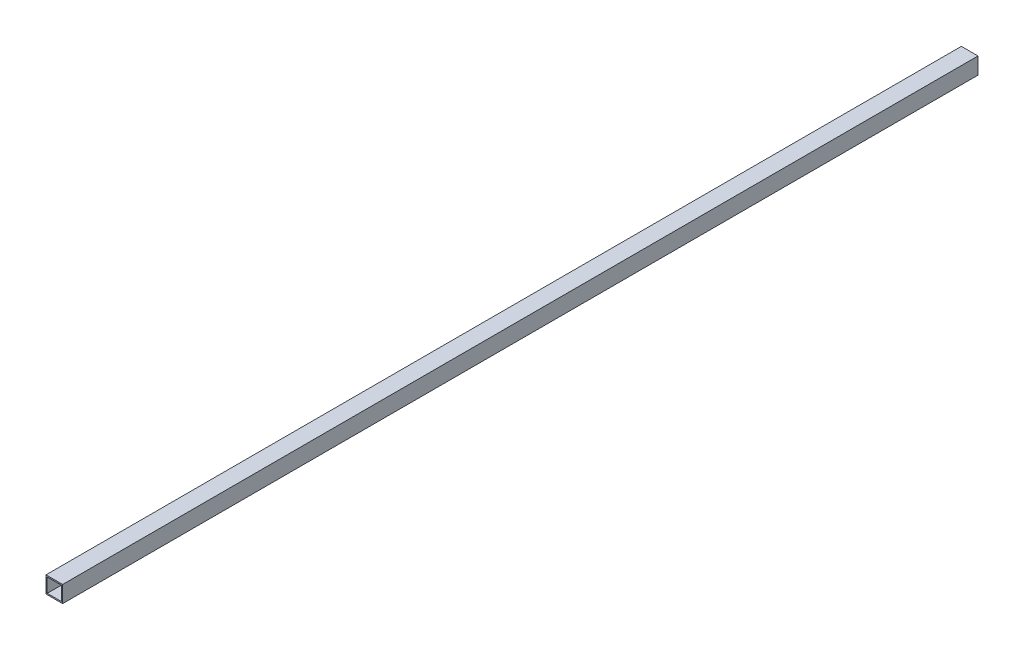
ISO-10303-21;
HEADER;
FILE_DESCRIPTION(('STEP AP214'),'2;1');
FILE_NAME('part.step','',(''),(''),'','','');
FILE_SCHEMA(('AUTOMOTIVE_DESIGN { 1 0 10303 214 1 1 1 1 }'));
ENDSEC;
DATA;
#1=APPLICATION_CONTEXT('core data for automotive mechanical design processes');
#2=APPLICATION_PROTOCOL_DEFINITION('international standard','automotive_design',2000,#1);
#3=PRODUCT_CONTEXT('',#1,'mechanical');
#4=PRODUCT('Part','Part','',(#3));
#5=PRODUCT_RELATED_PRODUCT_CATEGORY('part','',(#4));
#6=PRODUCT_DEFINITION_FORMATION('','',#4);
#7=PRODUCT_DEFINITION_CONTEXT('part definition',#1,'design');
#8=PRODUCT_DEFINITION('design','',#6,#7);
#9=PRODUCT_DEFINITION_SHAPE('','',#8);
#10=(LENGTH_UNIT() NAMED_UNIT(*) SI_UNIT(.MILLI.,.METRE.));
#11=(NAMED_UNIT(*) PLANE_ANGLE_UNIT() SI_UNIT($,.RADIAN.));
#12=(NAMED_UNIT(*) SI_UNIT($,.STERADIAN.) SOLID_ANGLE_UNIT());
#13=UNCERTAINTY_MEASURE_WITH_UNIT(LENGTH_MEASURE(1.E-05),#10,'distance_accuracy_value','');
#14=(GEOMETRIC_REPRESENTATION_CONTEXT(3) GLOBAL_UNCERTAINTY_ASSIGNED_CONTEXT((#13)) GLOBAL_UNIT_ASSIGNED_CONTEXT((#10,
#11,#12)) REPRESENTATION_CONTEXT('',''));
#15=CARTESIAN_POINT('',(0.,0.,0.));
#16=DIRECTION('',(0.,0.,1.));
#17=DIRECTION('',(1.,0.,0.));
#18=AXIS2_PLACEMENT_3D('',#15,#16,#17);
#19=CARTESIAN_POINT('',(20.,20.,2200.));
#20=DIRECTION('',(-1.,0.,0.));
#21=DIRECTION('',(0.,-1.,0.));
#22=AXIS2_PLACEMENT_3D('',#19,#20,#21);
#23=PLANE('',#22);
#24=DIRECTION('',(0.,1.,0.));
#25=VECTOR('',#24,1.);
#26=CARTESIAN_POINT('',(20.,20.,0.));
#27=LINE('',#26,#25);
#28=CARTESIAN_POINT('',(20.,-20.,0.));
#29=VERTEX_POINT('',#28);
#30=CARTESIAN_POINT('',(20.,20.,0.));
#31=VERTEX_POINT('',#30);
#32=EDGE_CURVE('E147',#29,#31,#27,.T.);
#33=ORIENTED_EDGE('',*,*,#32,.T.);
#34=DIRECTION('',(0.,0.,-1.));
#35=VECTOR('',#34,1.);
#36=CARTESIAN_POINT('',(20.,20.,2200.));
#37=LINE('',#36,#35);
#38=CARTESIAN_POINT('',(20.,20.,2200.));
#39=VERTEX_POINT('',#38);
#40=EDGE_CURVE('E11',#39,#31,#37,.T.);
#41=ORIENTED_EDGE('',*,*,#40,.F.);
#42=DIRECTION('',(0.,1.,0.));
#43=VECTOR('',#42,1.);
#44=CARTESIAN_POINT('',(20.,20.,2200.));
#45=LINE('',#44,#43);
#46=CARTESIAN_POINT('',(20.,-20.,2200.));
#47=VERTEX_POINT('',#46);
#48=EDGE_CURVE('E153',#47,#39,#45,.T.);
#49=ORIENTED_EDGE('',*,*,#48,.F.);
#50=DIRECTION('',(0.,0.,-1.));
#51=VECTOR('',#50,1.);
#52=CARTESIAN_POINT('',(20.,-20.,2200.));
#53=LINE('',#52,#51);
#54=EDGE_CURVE('E167',#47,#29,#53,.T.);
#55=ORIENTED_EDGE('',*,*,#54,.T.);
#56=EDGE_LOOP('',(#33,#41,#49,#55));
#57=FACE_BOUND('',#56,.T.);
#58=ADVANCED_FACE('F39',(#57),#23,.F.);
#59=CARTESIAN_POINT('',(-20.,20.,2200.));
#60=DIRECTION('',(0.,-1.,0.));
#61=DIRECTION('',(0.,0.,-1.));
#62=AXIS2_PLACEMENT_3D('',#59,#60,#61);
#63=PLANE('',#62);
#64=DIRECTION('',(-1.,0.,0.));
#65=VECTOR('',#64,1.);
#66=CARTESIAN_POINT('',(-20.,20.,0.));
#67=LINE('',#66,#65);
#68=CARTESIAN_POINT('',(-20.,20.,0.));
#69=VERTEX_POINT('',#68);
#70=EDGE_CURVE('E171',#31,#69,#67,.T.);
#71=ORIENTED_EDGE('',*,*,#70,.T.);
#72=DIRECTION('',(0.,0.,-1.));
#73=VECTOR('',#72,1.);
#74=CARTESIAN_POINT('',(-20.,20.,2200.));
#75=LINE('',#74,#73);
#76=CARTESIAN_POINT('',(-20.,20.,2200.));
#77=VERTEX_POINT('',#76);
#78=EDGE_CURVE('E47',#77,#69,#75,.T.);
#79=ORIENTED_EDGE('',*,*,#78,.F.);
#80=DIRECTION('',(-1.,0.,0.));
#81=VECTOR('',#80,1.);
#82=CARTESIAN_POINT('',(-20.,20.,2200.));
#83=LINE('',#82,#81);
#84=EDGE_CURVE('E157',#39,#77,#83,.T.);
#85=ORIENTED_EDGE('',*,*,#84,.F.);
#86=ORIENTED_EDGE('',*,*,#40,.T.);
#87=EDGE_LOOP('',(#71,#79,#85,#86));
#88=FACE_BOUND('',#87,.T.);
#89=ADVANCED_FACE('F205',(#88),#63,.F.);
#90=CARTESIAN_POINT('',(-20.,20.,2200.));
#91=DIRECTION('',(1.,0.,0.));
#92=DIRECTION('',(0.,0.,-1.));
#93=AXIS2_PLACEMENT_3D('',#90,#91,#92);
#94=PLANE('',#93);
#95=DIRECTION('',(0.,-1.,0.));
#96=VECTOR('',#95,1.);
#97=CARTESIAN_POINT('',(-20.,20.,0.));
#98=LINE('',#97,#96);
#99=CARTESIAN_POINT('',(-20.,-20.,0.));
#100=VERTEX_POINT('',#99);
#101=EDGE_CURVE('E174',#69,#100,#98,.T.);
#102=ORIENTED_EDGE('',*,*,#101,.T.);
#103=DIRECTION('',(0.,0.,-1.));
#104=VECTOR('',#103,1.);
#105=CARTESIAN_POINT('',(-20.,-20.,2200.));
#106=LINE('',#105,#104);
#107=CARTESIAN_POINT('',(-20.,-20.,2200.));
#108=VERTEX_POINT('',#107);
#109=EDGE_CURVE('E182',#108,#100,#106,.T.);
#110=ORIENTED_EDGE('',*,*,#109,.F.);
#111=DIRECTION('',(0.,-1.,0.));
#112=VECTOR('',#111,1.);
#113=CARTESIAN_POINT('',(-20.,20.,2200.));
#114=LINE('',#113,#112);
#115=EDGE_CURVE('E161',#77,#108,#114,.T.);
#116=ORIENTED_EDGE('',*,*,#115,.F.);
#117=ORIENTED_EDGE('',*,*,#78,.T.);
#118=EDGE_LOOP('',(#102,#110,#116,#117));
#119=FACE_BOUND('',#118,.T.);
#120=ADVANCED_FACE('F191',(#119),#94,.F.);
#121=CARTESIAN_POINT('',(-20.,-20.,2200.));
#122=DIRECTION('',(0.,1.,0.));
#123=DIRECTION('',(0.,0.,1.));
#124=AXIS2_PLACEMENT_3D('',#121,#122,#123);
#125=PLANE('',#124);
#126=DIRECTION('',(1.,0.,0.));
#127=VECTOR('',#126,1.);
#128=CARTESIAN_POINT('',(-20.,-20.,0.));
#129=LINE('',#128,#127);
#130=EDGE_CURVE('E158',#100,#29,#129,.T.);
#131=ORIENTED_EDGE('',*,*,#130,.T.);
#132=ORIENTED_EDGE('',*,*,#54,.F.);
#133=DIRECTION('',(1.,0.,0.));
#134=VECTOR('',#133,1.);
#135=CARTESIAN_POINT('',(-20.,-20.,2200.));
#136=LINE('',#135,#134);
#137=EDGE_CURVE('E164',#108,#47,#136,.T.);
#138=ORIENTED_EDGE('',*,*,#137,.F.);
#139=ORIENTED_EDGE('',*,*,#109,.T.);
#140=EDGE_LOOP('',(#131,#132,#138,#139));
#141=FACE_BOUND('',#140,.T.);
#142=ADVANCED_FACE('F200',(#141),#125,.F.);
#143=CARTESIAN_POINT('',(0.,0.,2200.));
#144=DIRECTION('',(0.,0.,1.));
#145=DIRECTION('',(1.,0.,0.));
#146=AXIS2_PLACEMENT_3D('',#143,#144,#145);
#147=PLANE('',#146);
#148=DIRECTION('',(0.,1.,0.));
#149=VECTOR('',#148,1.);
#150=CARTESIAN_POINT('',(-17.,17.,2200.));
#151=LINE('',#150,#149);
#152=CARTESIAN_POINT('',(-17.,-17.,2200.));
#153=VERTEX_POINT('',#152);
#154=CARTESIAN_POINT('',(-17.,17.,2200.));
#155=VERTEX_POINT('',#154);
#156=EDGE_CURVE('E106',#153,#155,#151,.T.);
#157=ORIENTED_EDGE('',*,*,#156,.T.);
#158=DIRECTION('',(1.,0.,0.));
#159=VECTOR('',#158,1.);
#160=CARTESIAN_POINT('',(17.,17.,2200.));
#161=LINE('',#160,#159);
#162=CARTESIAN_POINT('',(17.,17.,2200.));
#163=VERTEX_POINT('',#162);
#164=EDGE_CURVE('E116',#155,#163,#161,.T.);
#165=ORIENTED_EDGE('',*,*,#164,.T.);
#166=DIRECTION('',(0.,-1.,0.));
#167=VECTOR('',#166,1.);
#168=CARTESIAN_POINT('',(17.,17.,2200.));
#169=LINE('',#168,#167);
#170=CARTESIAN_POINT('',(17.,-17.,2200.));
#171=VERTEX_POINT('',#170);
#172=EDGE_CURVE('E54',#163,#171,#169,.T.);
#173=ORIENTED_EDGE('',*,*,#172,.T.);
#174=DIRECTION('',(-1.,0.,0.));
#175=VECTOR('',#174,1.);
#176=CARTESIAN_POINT('',(17.,-17.,2200.));
#177=LINE('',#176,#175);
#178=EDGE_CURVE('E113',#171,#153,#177,.T.);
#179=ORIENTED_EDGE('',*,*,#178,.T.);
#180=EDGE_LOOP('',(#157,#165,#173,#179));
#181=FACE_BOUND('',#180,.T.);
#182=ORIENTED_EDGE('',*,*,#48,.T.);
#183=ORIENTED_EDGE('',*,*,#84,.T.);
#184=ORIENTED_EDGE('',*,*,#115,.T.);
#185=ORIENTED_EDGE('',*,*,#137,.T.);
#186=EDGE_LOOP('',(#182,#183,#184,#185));
#187=FACE_BOUND('',#186,.T.);
#188=ADVANCED_FACE('F121',(#181,#187),#147,.T.);
#189=CARTESIAN_POINT('',(0.,0.,0.));
#190=DIRECTION('',(0.,0.,1.));
#191=DIRECTION('',(1.,0.,0.));
#192=AXIS2_PLACEMENT_3D('',#189,#190,#191);
#193=PLANE('',#192);
#194=DIRECTION('',(1.,0.,0.));
#195=VECTOR('',#194,1.);
#196=CARTESIAN_POINT('',(17.,17.,0.));
#197=LINE('',#196,#195);
#198=CARTESIAN_POINT('',(-17.,17.,0.));
#199=VERTEX_POINT('',#198);
#200=CARTESIAN_POINT('',(17.,17.,0.));
#201=VERTEX_POINT('',#200);
#202=EDGE_CURVE('E138',#199,#201,#197,.T.);
#203=ORIENTED_EDGE('',*,*,#202,.F.);
#204=DIRECTION('',(0.,1.,0.));
#205=VECTOR('',#204,1.);
#206=CARTESIAN_POINT('',(-17.,17.,0.));
#207=LINE('',#206,#205);
#208=CARTESIAN_POINT('',(-17.,-17.,0.));
#209=VERTEX_POINT('',#208);
#210=EDGE_CURVE('E62',#209,#199,#207,.T.);
#211=ORIENTED_EDGE('',*,*,#210,.F.);
#212=DIRECTION('',(-1.,0.,0.));
#213=VECTOR('',#212,1.);
#214=CARTESIAN_POINT('',(17.,-17.,0.));
#215=LINE('',#214,#213);
#216=CARTESIAN_POINT('',(17.,-17.,0.));
#217=VERTEX_POINT('',#216);
#218=EDGE_CURVE('E125',#217,#209,#215,.T.);
#219=ORIENTED_EDGE('',*,*,#218,.F.);
#220=DIRECTION('',(0.,-1.,0.));
#221=VECTOR('',#220,1.);
#222=CARTESIAN_POINT('',(17.,17.,0.));
#223=LINE('',#222,#221);
#224=EDGE_CURVE('E129',#201,#217,#223,.T.);
#225=ORIENTED_EDGE('',*,*,#224,.F.);
#226=EDGE_LOOP('',(#203,#211,#219,#225));
#227=FACE_BOUND('',#226,.T.);
#228=ORIENTED_EDGE('',*,*,#32,.F.);
#229=ORIENTED_EDGE('',*,*,#130,.F.);
#230=ORIENTED_EDGE('',*,*,#101,.F.);
#231=ORIENTED_EDGE('',*,*,#70,.F.);
#232=EDGE_LOOP('',(#228,#229,#230,#231));
#233=FACE_BOUND('',#232,.T.);
#234=ADVANCED_FACE('F197',(#227,#233),#193,.F.);
#235=CARTESIAN_POINT('',(-17.,17.,2200.));
#236=DIRECTION('',(-1.,0.,0.));
#237=DIRECTION('',(0.,-1.,0.));
#238=AXIS2_PLACEMENT_3D('',#235,#236,#237);
#239=PLANE('',#238);
#240=ORIENTED_EDGE('',*,*,#210,.T.);
#241=DIRECTION('',(0.,0.,-1.));
#242=VECTOR('',#241,1.);
#243=CARTESIAN_POINT('',(-17.,17.,2200.));
#244=LINE('',#243,#242);
#245=EDGE_CURVE('E102',#155,#199,#244,.T.);
#246=ORIENTED_EDGE('',*,*,#245,.F.);
#247=ORIENTED_EDGE('',*,*,#156,.F.);
#248=DIRECTION('',(0.,0.,-1.));
#249=VECTOR('',#248,1.);
#250=CARTESIAN_POINT('',(-17.,-17.,2200.));
#251=LINE('',#250,#249);
#252=EDGE_CURVE('E144',#153,#209,#251,.T.);
#253=ORIENTED_EDGE('',*,*,#252,.T.);
#254=EDGE_LOOP('',(#240,#246,#247,#253));
#255=FACE_BOUND('',#254,.T.);
#256=ADVANCED_FACE('F104',(#255),#239,.F.);
#257=CARTESIAN_POINT('',(17.,-17.,2200.));
#258=DIRECTION('',(0.,-1.,0.));
#259=DIRECTION('',(0.,0.,-1.));
#260=AXIS2_PLACEMENT_3D('',#257,#258,#259);
#261=PLANE('',#260);
#262=ORIENTED_EDGE('',*,*,#218,.T.);
#263=ORIENTED_EDGE('',*,*,#252,.F.);
#264=ORIENTED_EDGE('',*,*,#178,.F.);
#265=DIRECTION('',(0.,0.,-1.));
#266=VECTOR('',#265,1.);
#267=CARTESIAN_POINT('',(17.,-17.,2200.));
#268=LINE('',#267,#266);
#269=EDGE_CURVE('E148',#171,#217,#268,.T.);
#270=ORIENTED_EDGE('',*,*,#269,.T.);
#271=EDGE_LOOP('',(#262,#263,#264,#270));
#272=FACE_BOUND('',#271,.T.);
#273=ADVANCED_FACE('F222',(#272),#261,.F.);
#274=CARTESIAN_POINT('',(17.,17.,2200.));
#275=DIRECTION('',(1.,0.,0.));
#276=DIRECTION('',(0.,1.,0.));
#277=AXIS2_PLACEMENT_3D('',#274,#275,#276);
#278=PLANE('',#277);
#279=ORIENTED_EDGE('',*,*,#224,.T.);
#280=ORIENTED_EDGE('',*,*,#269,.F.);
#281=ORIENTED_EDGE('',*,*,#172,.F.);
#282=DIRECTION('',(0.,0.,-1.));
#283=VECTOR('',#282,1.);
#284=CARTESIAN_POINT('',(17.,17.,2200.));
#285=LINE('',#284,#283);
#286=EDGE_CURVE('E112',#163,#201,#285,.T.);
#287=ORIENTED_EDGE('',*,*,#286,.T.);
#288=EDGE_LOOP('',(#279,#280,#281,#287));
#289=FACE_BOUND('',#288,.T.);
#290=ADVANCED_FACE('F225',(#289),#278,.F.);
#291=CARTESIAN_POINT('',(17.,17.,2200.));
#292=DIRECTION('',(0.,1.,0.));
#293=DIRECTION('',(0.,0.,1.));
#294=AXIS2_PLACEMENT_3D('',#291,#292,#293);
#295=PLANE('',#294);
#296=ORIENTED_EDGE('',*,*,#202,.T.);
#297=ORIENTED_EDGE('',*,*,#286,.F.);
#298=ORIENTED_EDGE('',*,*,#164,.F.);
#299=ORIENTED_EDGE('',*,*,#245,.T.);
#300=EDGE_LOOP('',(#296,#297,#298,#299));
#301=FACE_BOUND('',#300,.T.);
#302=ADVANCED_FACE('F117',(#301),#295,.F.);
#303=CLOSED_SHELL('',(#58,#89,#120,#142,#188,#234,#256,#273,#290,#302));
#304=MANIFOLD_SOLID_BREP('B2',#303);
#305=ADVANCED_BREP_SHAPE_REPRESENTATION('',(#18,#304),#14);
#306=SHAPE_DEFINITION_REPRESENTATION(#9,#305);
ENDSEC;
END-ISO-10303-21;
